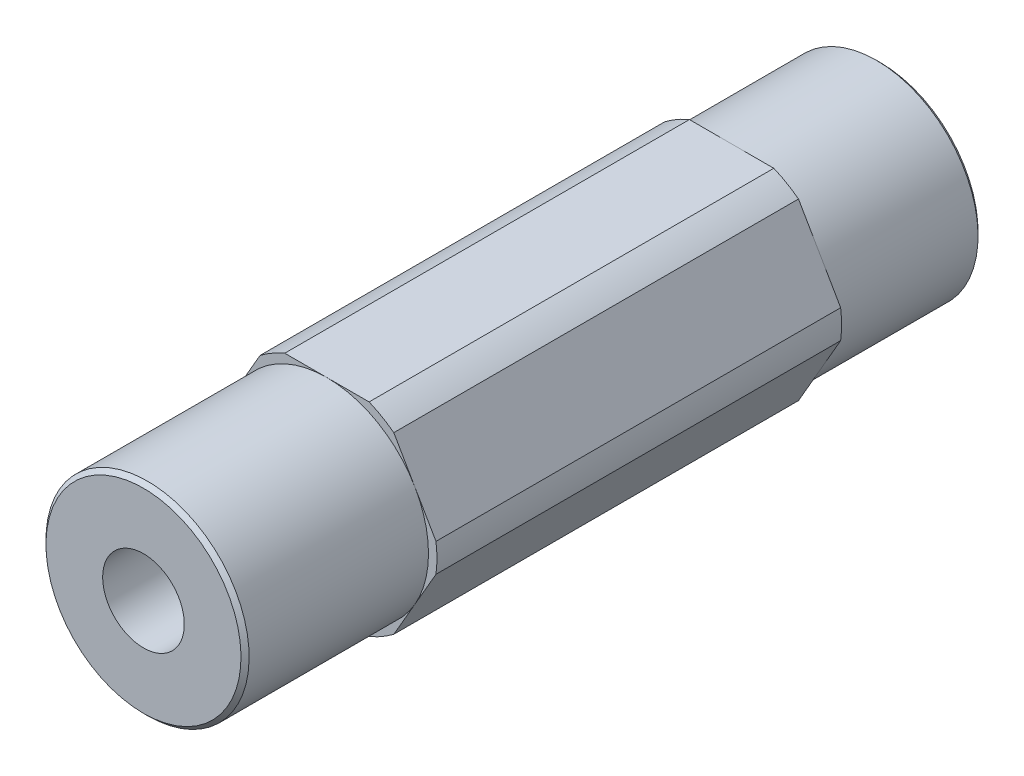
ISO-10303-21;
HEADER;
FILE_DESCRIPTION(('STEP AP214'),'2;1');
FILE_NAME('part.step','',(''),(''),'','','');
FILE_SCHEMA(('AUTOMOTIVE_DESIGN { 1 0 10303 214 1 1 1 1 }'));
ENDSEC;
DATA;
#1=APPLICATION_CONTEXT('core data for automotive mechanical design processes');
#2=APPLICATION_PROTOCOL_DEFINITION('international standard','automotive_design',2000,#1);
#3=PRODUCT_CONTEXT('',#1,'mechanical');
#4=PRODUCT('Part','Part','',(#3));
#5=PRODUCT_RELATED_PRODUCT_CATEGORY('part','',(#4));
#6=PRODUCT_DEFINITION_FORMATION('','',#4);
#7=PRODUCT_DEFINITION_CONTEXT('part definition',#1,'design');
#8=PRODUCT_DEFINITION('design','',#6,#7);
#9=PRODUCT_DEFINITION_SHAPE('','',#8);
#10=(LENGTH_UNIT() NAMED_UNIT(*) SI_UNIT(.MILLI.,.METRE.));
#11=(NAMED_UNIT(*) PLANE_ANGLE_UNIT() SI_UNIT($,.RADIAN.));
#12=(NAMED_UNIT(*) SI_UNIT($,.STERADIAN.) SOLID_ANGLE_UNIT());
#13=UNCERTAINTY_MEASURE_WITH_UNIT(LENGTH_MEASURE(1.E-05),#10,'distance_accuracy_value','');
#14=(GEOMETRIC_REPRESENTATION_CONTEXT(3) GLOBAL_UNCERTAINTY_ASSIGNED_CONTEXT((#13)) GLOBAL_UNIT_ASSIGNED_CONTEXT((#10,
#11,#12)) REPRESENTATION_CONTEXT('',''));
#15=CARTESIAN_POINT('',(0.,0.,0.));
#16=DIRECTION('',(0.,0.,1.));
#17=DIRECTION('',(1.,0.,0.));
#18=AXIS2_PLACEMENT_3D('',#15,#16,#17);
#19=CARTESIAN_POINT('',(0.,6.87577999999999,34.6075));
#20=DIRECTION('',(0.,0.,1.));
#21=DIRECTION('',(0.,-1.,0.));
#22=AXIS2_PLACEMENT_3D('',#19,#20,#21);
#23=PLANE('',#22);
#24=CARTESIAN_POINT('',(0.,0.,34.6075));
#25=DIRECTION('',(0.,0.,-1.));
#26=DIRECTION('',(0.,1.,0.));
#27=AXIS2_PLACEMENT_3D('',#24,#25,#26);
#28=CIRCLE('',#27,6.87577999999999);
#29=CARTESIAN_POINT('',(-2.63701547367471,-6.35000000000001,34.6075));
#30=VERTEX_POINT('',#29);
#31=CARTESIAN_POINT('',(-4.18075357719383,-5.45872239037497,34.6075));
#32=VERTEX_POINT('',#31);
#33=EDGE_CURVE('E376',#30,#32,#28,.T.);
#34=ORIENTED_EDGE('',*,*,#33,.F.);
#35=DIRECTION('',(1.,0.,0.));
#36=VECTOR('',#35,1.);
#37=CARTESIAN_POINT('',(0.,-6.35,34.6075));
#38=LINE('',#37,#36);
#39=CARTESIAN_POINT('',(0.,-6.35,34.6075));
#40=VERTEX_POINT('',#39);
#41=EDGE_CURVE('E354',#30,#40,#38,.T.);
#42=ORIENTED_EDGE('',*,*,#41,.T.);
#43=CARTESIAN_POINT('',(0.,0.,34.6075));
#44=DIRECTION('',(0.,0.,-1.));
#45=DIRECTION('',(0.,1.,0.));
#46=AXIS2_PLACEMENT_3D('',#43,#44,#45);
#47=CIRCLE('',#46,6.35);
#48=CARTESIAN_POINT('',(-5.49926131403118,-3.17500000000001,34.6075));
#49=VERTEX_POINT('',#48);
#50=EDGE_CURVE('E286',#40,#49,#47,.T.);
#51=ORIENTED_EDGE('',*,*,#50,.T.);
#52=DIRECTION('',(0.5,-0.866025403784439,0.));
#53=VECTOR('',#52,1.);
#54=CARTESIAN_POINT('',(-8.47656138944766,1.98183499999999,34.6075));
#55=LINE('',#54,#53);
#56=EDGE_CURVE('E386',#49,#32,#55,.T.);
#57=ORIENTED_EDGE('',*,*,#56,.T.);
#58=EDGE_LOOP('',(#34,#42,#51,#57));
#59=FACE_BOUND('',#58,.T.);
#60=ADVANCED_FACE('F49',(#59),#23,.T.);
#61=CARTESIAN_POINT('',(5.49926131403119,-3.17500000000001,34.6075));
#62=VERTEX_POINT('',#61);
#63=EDGE_CURVE('E287',#62,#40,#47,.T.);
#64=ORIENTED_EDGE('',*,*,#63,.T.);
#65=CARTESIAN_POINT('',(2.63701547367472,-6.35000000000001,34.6075));
#66=VERTEX_POINT('',#65);
#67=EDGE_CURVE('E357',#40,#66,#38,.T.);
#68=ORIENTED_EDGE('',*,*,#67,.T.);
#69=CARTESIAN_POINT('',(4.18075357719383,-5.45872239037496,34.6075));
#70=VERTEX_POINT('',#69);
#71=EDGE_CURVE('E371',#70,#66,#28,.T.);
#72=ORIENTED_EDGE('',*,*,#71,.F.);
#73=DIRECTION('',(0.5,0.866025403784439,0.));
#74=VECTOR('',#73,1.);
#75=CARTESIAN_POINT('',(8.47656138944767,1.98183499999999,34.6075));
#76=LINE('',#75,#74);
#77=EDGE_CURVE('E341',#70,#62,#76,.T.);
#78=ORIENTED_EDGE('',*,*,#77,.T.);
#79=EDGE_LOOP('',(#64,#68,#72,#78));
#80=FACE_BOUND('',#79,.T.);
#81=ADVANCED_FACE('F250',(#80),#23,.T.);
#82=CARTESIAN_POINT('',(5.49926131403119,3.17499999999999,34.6075));
#83=VERTEX_POINT('',#82);
#84=EDGE_CURVE('E229',#83,#62,#47,.T.);
#85=ORIENTED_EDGE('',*,*,#84,.T.);
#86=CARTESIAN_POINT('',(6.81776905086854,-0.891277609625052,34.6075));
#87=VERTEX_POINT('',#86);
#88=EDGE_CURVE('E344',#62,#87,#76,.T.);
#89=ORIENTED_EDGE('',*,*,#88,.T.);
#90=CARTESIAN_POINT('',(6.81776905086855,0.891277609625033,34.6075));
#91=VERTEX_POINT('',#90);
#92=EDGE_CURVE('E224',#91,#87,#28,.T.);
#93=ORIENTED_EDGE('',*,*,#92,.F.);
#94=DIRECTION('',(-0.5,0.866025403784439,0.));
#95=VECTOR('',#94,1.);
#96=CARTESIAN_POINT('',(2.52196123861471,8.33183499999999,34.6075));
#97=LINE('',#96,#95);
#98=EDGE_CURVE('E328',#91,#83,#97,.T.);
#99=ORIENTED_EDGE('',*,*,#98,.T.);
#100=EDGE_LOOP('',(#85,#89,#93,#99));
#101=FACE_BOUND('',#100,.T.);
#102=ADVANCED_FACE('F257',(#101),#23,.T.);
#103=CARTESIAN_POINT('',(0.,6.35,34.6075));
#104=VERTEX_POINT('',#103);
#105=EDGE_CURVE('E225',#104,#83,#47,.T.);
#106=ORIENTED_EDGE('',*,*,#105,.T.);
#107=CARTESIAN_POINT('',(4.18075357719383,5.45872239037495,34.6075));
#108=VERTEX_POINT('',#107);
#109=EDGE_CURVE('E303',#83,#108,#97,.T.);
#110=ORIENTED_EDGE('',*,*,#109,.T.);
#111=CARTESIAN_POINT('',(2.63701547367471,6.35,34.6075));
#112=VERTEX_POINT('',#111);
#113=EDGE_CURVE('E220',#112,#108,#28,.T.);
#114=ORIENTED_EDGE('',*,*,#113,.F.);
#115=DIRECTION('',(-1.,0.,0.));
#116=VECTOR('',#115,1.);
#117=CARTESIAN_POINT('',(0.,6.35,34.6075));
#118=LINE('',#117,#116);
#119=EDGE_CURVE('E304',#112,#104,#118,.T.);
#120=ORIENTED_EDGE('',*,*,#119,.T.);
#121=EDGE_LOOP('',(#106,#110,#114,#120));
#122=FACE_BOUND('',#121,.T.);
#123=ADVANCED_FACE('F273',(#122),#23,.T.);
#124=CARTESIAN_POINT('',(-5.49926131403119,3.17499999999999,34.6075));
#125=VERTEX_POINT('',#124);
#126=EDGE_CURVE('E223',#125,#104,#47,.T.);
#127=ORIENTED_EDGE('',*,*,#126,.T.);
#128=CARTESIAN_POINT('',(-2.63701547367471,6.35,34.6075));
#129=VERTEX_POINT('',#128);
#130=EDGE_CURVE('E293',#104,#129,#118,.T.);
#131=ORIENTED_EDGE('',*,*,#130,.T.);
#132=CARTESIAN_POINT('',(-4.18075357719383,5.45872239037495,34.6075));
#133=VERTEX_POINT('',#132);
#134=EDGE_CURVE('E218',#133,#129,#28,.T.);
#135=ORIENTED_EDGE('',*,*,#134,.F.);
#136=DIRECTION('',(-0.5,-0.866025403784439,0.));
#137=VECTOR('',#136,1.);
#138=CARTESIAN_POINT('',(-2.52196123861471,8.33183499999999,34.6075));
#139=LINE('',#138,#137);
#140=EDGE_CURVE('E295',#133,#125,#139,.T.);
#141=ORIENTED_EDGE('',*,*,#140,.T.);
#142=EDGE_LOOP('',(#127,#131,#135,#141));
#143=FACE_BOUND('',#142,.T.);
#144=ADVANCED_FACE('F264',(#143),#23,.T.);
#145=EDGE_CURVE('E279',#49,#125,#47,.T.);
#146=ORIENTED_EDGE('',*,*,#145,.T.);
#147=CARTESIAN_POINT('',(-6.81776905086855,0.89127760962503,34.6075));
#148=VERTEX_POINT('',#147);
#149=EDGE_CURVE('E281',#125,#148,#139,.T.);
#150=ORIENTED_EDGE('',*,*,#149,.T.);
#151=CARTESIAN_POINT('',(-6.81776905086855,-0.891277609625049,34.6075));
#152=VERTEX_POINT('',#151);
#153=EDGE_CURVE('E379',#152,#148,#28,.T.);
#154=ORIENTED_EDGE('',*,*,#153,.F.);
#155=EDGE_CURVE('E192',#152,#49,#55,.T.);
#156=ORIENTED_EDGE('',*,*,#155,.T.);
#157=EDGE_LOOP('',(#146,#150,#154,#156));
#158=FACE_BOUND('',#157,.T.);
#159=ADVANCED_FACE('F253',(#158),#23,.T.);
#160=CARTESIAN_POINT('',(0.,0.,-29.5405141562854));
#161=DIRECTION('',(0.,0.,-1.));
#162=DIRECTION('',(0.,1.,0.));
#163=AXIS2_PLACEMENT_3D('',#160,#161,#162);
#164=CYLINDRICAL_SURFACE('',#163,6.87577999999999);
#165=CARTESIAN_POINT('',(0.,0.,9.3091));
#166=DIRECTION('',(0.,0.,-1.));
#167=DIRECTION('',(0.,1.,0.));
#168=AXIS2_PLACEMENT_3D('',#165,#166,#167);
#169=CIRCLE('',#168,6.87577999999999);
#170=CARTESIAN_POINT('',(-2.63701547367472,-6.35,9.3091));
#171=VERTEX_POINT('',#170);
#172=CARTESIAN_POINT('',(-4.18075357719383,-5.45872239037497,9.3091));
#173=VERTEX_POINT('',#172);
#174=EDGE_CURVE('E190',#171,#173,#169,.T.);
#175=ORIENTED_EDGE('',*,*,#174,.F.);
#176=DIRECTION('',(0.,0.,-1.));
#177=VECTOR('',#176,1.);
#178=CARTESIAN_POINT('',(-2.63701547367471,-6.35,-29.5405141562854));
#179=LINE('',#178,#177);
#180=EDGE_CURVE('E350',#171,#30,#179,.F.);
#181=ORIENTED_EDGE('',*,*,#180,.T.);
#182=ORIENTED_EDGE('',*,*,#33,.T.);
#183=DIRECTION('',(0.,0.,-1.));
#184=VECTOR('',#183,1.);
#185=CARTESIAN_POINT('',(-4.18075357719383,-5.45872239037496,-29.5405141562854));
#186=LINE('',#185,#184);
#187=EDGE_CURVE('E191',#32,#173,#186,.T.);
#188=ORIENTED_EDGE('',*,*,#187,.T.);
#189=EDGE_LOOP('',(#175,#181,#182,#188));
#190=FACE_BOUND('',#189,.T.);
#191=ADVANCED_FACE('F263',(#190),#164,.T.);
#192=ORIENTED_EDGE('',*,*,#71,.T.);
#193=DIRECTION('',(0.,0.,-1.));
#194=VECTOR('',#193,1.);
#195=CARTESIAN_POINT('',(2.63701547367472,-6.35,-29.5405141562854));
#196=LINE('',#195,#194);
#197=CARTESIAN_POINT('',(2.63701547367472,-6.35,9.3091));
#198=VERTEX_POINT('',#197);
#199=EDGE_CURVE('E358',#66,#198,#196,.T.);
#200=ORIENTED_EDGE('',*,*,#199,.T.);
#201=CARTESIAN_POINT('',(4.18075357719383,-5.45872239037496,9.3091));
#202=VERTEX_POINT('',#201);
#203=EDGE_CURVE('E642',#202,#198,#169,.T.);
#204=ORIENTED_EDGE('',*,*,#203,.F.);
#205=DIRECTION('',(0.,0.,-1.));
#206=VECTOR('',#205,1.);
#207=CARTESIAN_POINT('',(4.18075357719383,-5.45872239037496,-29.5405141562854));
#208=LINE('',#207,#206);
#209=EDGE_CURVE('E337',#202,#70,#208,.F.);
#210=ORIENTED_EDGE('',*,*,#209,.T.);
#211=EDGE_LOOP('',(#192,#200,#204,#210));
#212=FACE_BOUND('',#211,.T.);
#213=ADVANCED_FACE('F270',(#212),#164,.T.);
#214=ORIENTED_EDGE('',*,*,#92,.T.);
#215=DIRECTION('',(0.,0.,-1.));
#216=VECTOR('',#215,1.);
#217=CARTESIAN_POINT('',(6.81776905086854,-0.891277609625044,-29.5405141562854));
#218=LINE('',#217,#216);
#219=CARTESIAN_POINT('',(6.81776905086855,-0.891277609625045,9.3091));
#220=VERTEX_POINT('',#219);
#221=EDGE_CURVE('E345',#87,#220,#218,.T.);
#222=ORIENTED_EDGE('',*,*,#221,.T.);
#223=CARTESIAN_POINT('',(6.81776905086854,0.891277609625047,9.3091));
#224=VERTEX_POINT('',#223);
#225=EDGE_CURVE('E219',#224,#220,#169,.T.);
#226=ORIENTED_EDGE('',*,*,#225,.F.);
#227=DIRECTION('',(0.,0.,-1.));
#228=VECTOR('',#227,1.);
#229=CARTESIAN_POINT('',(6.81776905086855,0.891277609625041,-29.5405141562854));
#230=LINE('',#229,#228);
#231=EDGE_CURVE('E318',#224,#91,#230,.F.);
#232=ORIENTED_EDGE('',*,*,#231,.T.);
#233=EDGE_LOOP('',(#214,#222,#226,#232));
#234=FACE_BOUND('',#233,.T.);
#235=ADVANCED_FACE('F488',(#234),#164,.T.);
#236=ORIENTED_EDGE('',*,*,#113,.T.);
#237=DIRECTION('',(0.,0.,-1.));
#238=VECTOR('',#237,1.);
#239=CARTESIAN_POINT('',(4.18075357719383,5.45872239037496,-29.5405141562854));
#240=LINE('',#239,#238);
#241=CARTESIAN_POINT('',(4.18075357719384,5.45872239037495,9.3091));
#242=VERTEX_POINT('',#241);
#243=EDGE_CURVE('E331',#108,#242,#240,.T.);
#244=ORIENTED_EDGE('',*,*,#243,.T.);
#245=CARTESIAN_POINT('',(2.6370154736747,6.35,9.3091));
#246=VERTEX_POINT('',#245);
#247=EDGE_CURVE('E215',#246,#242,#169,.T.);
#248=ORIENTED_EDGE('',*,*,#247,.F.);
#249=DIRECTION('',(0.,0.,-1.));
#250=VECTOR('',#249,1.);
#251=CARTESIAN_POINT('',(2.63701547367471,6.35,-29.5405141562854));
#252=LINE('',#251,#250);
#253=EDGE_CURVE('E308',#246,#112,#252,.F.);
#254=ORIENTED_EDGE('',*,*,#253,.T.);
#255=EDGE_LOOP('',(#236,#244,#248,#254));
#256=FACE_BOUND('',#255,.T.);
#257=ADVANCED_FACE('F398',(#256),#164,.T.);
#258=ORIENTED_EDGE('',*,*,#134,.T.);
#259=DIRECTION('',(0.,0.,-1.));
#260=VECTOR('',#259,1.);
#261=CARTESIAN_POINT('',(-2.63701547367471,6.35,-29.5405141562854));
#262=LINE('',#261,#260);
#263=CARTESIAN_POINT('',(-2.6370154736747,6.35,9.3091));
#264=VERTEX_POINT('',#263);
#265=EDGE_CURVE('E311',#129,#264,#262,.T.);
#266=ORIENTED_EDGE('',*,*,#265,.T.);
#267=CARTESIAN_POINT('',(-4.18075357719383,5.45872239037495,9.3091));
#268=VERTEX_POINT('',#267);
#269=EDGE_CURVE('E212',#268,#264,#169,.T.);
#270=ORIENTED_EDGE('',*,*,#269,.F.);
#271=DIRECTION('',(0.,0.,-1.));
#272=VECTOR('',#271,1.);
#273=CARTESIAN_POINT('',(-4.18075357719383,5.45872239037496,-29.5405141562854));
#274=LINE('',#273,#272);
#275=EDGE_CURVE('E64',#268,#133,#274,.F.);
#276=ORIENTED_EDGE('',*,*,#275,.T.);
#277=EDGE_LOOP('',(#258,#266,#270,#276));
#278=FACE_BOUND('',#277,.T.);
#279=ADVANCED_FACE('F382',(#278),#164,.T.);
#280=ORIENTED_EDGE('',*,*,#153,.T.);
#281=DIRECTION('',(0.,0.,-1.));
#282=VECTOR('',#281,1.);
#283=CARTESIAN_POINT('',(-6.81776905086855,0.891277609625038,-29.5405141562854));
#284=LINE('',#283,#282);
#285=CARTESIAN_POINT('',(-6.81776905086854,0.891277609625042,9.3091));
#286=VERTEX_POINT('',#285);
#287=EDGE_CURVE('E390',#148,#286,#284,.T.);
#288=ORIENTED_EDGE('',*,*,#287,.T.);
#289=CARTESIAN_POINT('',(-6.81776905086855,-0.891277609625042,9.3091));
#290=VERTEX_POINT('',#289);
#291=EDGE_CURVE('E644',#290,#286,#169,.T.);
#292=ORIENTED_EDGE('',*,*,#291,.F.);
#293=DIRECTION('',(0.,0.,-1.));
#294=VECTOR('',#293,1.);
#295=CARTESIAN_POINT('',(-6.81776905086855,-0.891277609625041,-29.5405141562854));
#296=LINE('',#295,#294);
#297=EDGE_CURVE('E72',#290,#152,#296,.F.);
#298=ORIENTED_EDGE('',*,*,#297,.T.);
#299=EDGE_LOOP('',(#280,#288,#292,#298));
#300=FACE_BOUND('',#299,.T.);
#301=ADVANCED_FACE('F272',(#300),#164,.T.);
#302=CARTESIAN_POINT('',(0.,6.87577999999999,9.3091));
#303=DIRECTION('',(0.,0.,-1.));
#304=DIRECTION('',(0.,1.,0.));
#305=AXIS2_PLACEMENT_3D('',#302,#303,#304);
#306=PLANE('',#305);
#307=ORIENTED_EDGE('',*,*,#203,.T.);
#308=DIRECTION('',(-1.,0.,0.));
#309=VECTOR('',#308,1.);
#310=CARTESIAN_POINT('',(0.,-6.35,9.3091));
#311=LINE('',#310,#309);
#312=CARTESIAN_POINT('',(0.,-6.35,9.3091));
#313=VERTEX_POINT('',#312);
#314=EDGE_CURVE('E351',#198,#313,#311,.T.);
#315=ORIENTED_EDGE('',*,*,#314,.T.);
#316=CARTESIAN_POINT('',(0.,0.,9.3091));
#317=DIRECTION('',(0.,0.,-1.));
#318=DIRECTION('',(0.,1.,0.));
#319=AXIS2_PLACEMENT_3D('',#316,#317,#318);
#320=CIRCLE('',#319,6.35);
#321=CARTESIAN_POINT('',(5.49926131403119,-3.175,9.3091));
#322=VERTEX_POINT('',#321);
#323=EDGE_CURVE('E206',#322,#313,#320,.T.);
#324=ORIENTED_EDGE('',*,*,#323,.F.);
#325=DIRECTION('',(-0.5,-0.866025403784439,0.));
#326=VECTOR('',#325,1.);
#327=CARTESIAN_POINT('',(8.47656138944767,1.98183499999999,9.3091));
#328=LINE('',#327,#326);
#329=EDGE_CURVE('E334',#322,#202,#328,.T.);
#330=ORIENTED_EDGE('',*,*,#329,.T.);
#331=EDGE_LOOP('',(#307,#315,#324,#330));
#332=FACE_BOUND('',#331,.T.);
#333=ADVANCED_FACE('F433',(#332),#306,.T.);
#334=CARTESIAN_POINT('',(-5.49926131403119,-3.175,9.3091));
#335=VERTEX_POINT('',#334);
#336=EDGE_CURVE('E187',#313,#335,#320,.T.);
#337=ORIENTED_EDGE('',*,*,#336,.F.);
#338=EDGE_CURVE('E348',#313,#171,#311,.T.);
#339=ORIENTED_EDGE('',*,*,#338,.T.);
#340=ORIENTED_EDGE('',*,*,#174,.T.);
#341=DIRECTION('',(-0.5,0.866025403784439,0.));
#342=VECTOR('',#341,1.);
#343=CARTESIAN_POINT('',(-8.47656138944766,1.98183499999999,9.3091));
#344=LINE('',#343,#342);
#345=EDGE_CURVE('E174',#173,#335,#344,.T.);
#346=ORIENTED_EDGE('',*,*,#345,.T.);
#347=EDGE_LOOP('',(#337,#339,#340,#346));
#348=FACE_BOUND('',#347,.T.);
#349=ADVANCED_FACE('F184',(#348),#306,.T.);
#350=ORIENTED_EDGE('',*,*,#225,.T.);
#351=EDGE_CURVE('E338',#220,#322,#328,.T.);
#352=ORIENTED_EDGE('',*,*,#351,.T.);
#353=CARTESIAN_POINT('',(5.49926131403119,3.17499999999999,9.3091));
#354=VERTEX_POINT('',#353);
#355=EDGE_CURVE('E207',#354,#322,#320,.T.);
#356=ORIENTED_EDGE('',*,*,#355,.F.);
#357=DIRECTION('',(0.5,-0.866025403784439,0.));
#358=VECTOR('',#357,1.);
#359=CARTESIAN_POINT('',(2.52196123861471,8.33183499999999,9.3091));
#360=LINE('',#359,#358);
#361=EDGE_CURVE('E316',#354,#224,#360,.T.);
#362=ORIENTED_EDGE('',*,*,#361,.T.);
#363=EDGE_LOOP('',(#350,#352,#356,#362));
#364=FACE_BOUND('',#363,.T.);
#365=ADVANCED_FACE('F405',(#364),#306,.T.);
#366=ORIENTED_EDGE('',*,*,#247,.T.);
#367=EDGE_CURVE('E320',#242,#354,#360,.T.);
#368=ORIENTED_EDGE('',*,*,#367,.T.);
#369=CARTESIAN_POINT('',(0.,6.35,9.3091));
#370=VERTEX_POINT('',#369);
#371=EDGE_CURVE('E208',#370,#354,#320,.T.);
#372=ORIENTED_EDGE('',*,*,#371,.F.);
#373=DIRECTION('',(1.,0.,0.));
#374=VECTOR('',#373,1.);
#375=CARTESIAN_POINT('',(0.,6.35,9.3091));
#376=LINE('',#375,#374);
#377=EDGE_CURVE('E313',#370,#246,#376,.T.);
#378=ORIENTED_EDGE('',*,*,#377,.T.);
#379=EDGE_LOOP('',(#366,#368,#372,#378));
#380=FACE_BOUND('',#379,.T.);
#381=ADVANCED_FACE('F395',(#380),#306,.T.);
#382=ORIENTED_EDGE('',*,*,#269,.T.);
#383=EDGE_CURVE('E307',#264,#370,#376,.T.);
#384=ORIENTED_EDGE('',*,*,#383,.T.);
#385=CARTESIAN_POINT('',(-5.49926131403119,3.17499999999999,9.3091));
#386=VERTEX_POINT('',#385);
#387=EDGE_CURVE('E201',#386,#370,#320,.T.);
#388=ORIENTED_EDGE('',*,*,#387,.F.);
#389=DIRECTION('',(0.5,0.866025403784439,0.));
#390=VECTOR('',#389,1.);
#391=CARTESIAN_POINT('',(-2.52196123861471,8.33183499999999,9.3091));
#392=LINE('',#391,#390);
#393=EDGE_CURVE('E383',#386,#268,#392,.T.);
#394=ORIENTED_EDGE('',*,*,#393,.T.);
#395=EDGE_LOOP('',(#382,#384,#388,#394));
#396=FACE_BOUND('',#395,.T.);
#397=ADVANCED_FACE('F408',(#396),#306,.T.);
#398=ORIENTED_EDGE('',*,*,#291,.T.);
#399=EDGE_CURVE('E197',#286,#386,#392,.T.);
#400=ORIENTED_EDGE('',*,*,#399,.T.);
#401=EDGE_CURVE('E195',#335,#386,#320,.T.);
#402=ORIENTED_EDGE('',*,*,#401,.F.);
#403=EDGE_CURVE('E171',#335,#290,#344,.T.);
#404=ORIENTED_EDGE('',*,*,#403,.T.);
#405=EDGE_LOOP('',(#398,#400,#402,#404));
#406=FACE_BOUND('',#405,.T.);
#407=ADVANCED_FACE('F196',(#406),#306,.T.);
#408=CARTESIAN_POINT('',(0.,0.,0.));
#409=DIRECTION('',(0.,0.,-1.));
#410=DIRECTION('',(0.,1.,0.));
#411=AXIS2_PLACEMENT_3D('',#408,#409,#410);
#412=PLANE('',#411);
#413=CARTESIAN_POINT('',(0.,0.,0.));
#414=DIRECTION('',(0.,0.,-1.));
#415=DIRECTION('',(0.,1.,0.));
#416=AXIS2_PLACEMENT_3D('',#413,#414,#415);
#417=CIRCLE('',#416,6.096);
#418=CARTESIAN_POINT('',(0.,6.096,0.));
#419=VERTEX_POINT('',#418);
#420=EDGE_CURVE('E228',#419,#419,#417,.T.);
#421=ORIENTED_EDGE('',*,*,#420,.T.);
#422=EDGE_LOOP('',(#421));
#423=FACE_BOUND('',#422,.T.);
#424=CARTESIAN_POINT('',(0.,0.,0.));
#425=DIRECTION('',(0.,0.,-1.));
#426=DIRECTION('',(-1.,0.,0.));
#427=AXIS2_PLACEMENT_3D('',#424,#425,#426);
#428=CIRCLE('',#427,2.5527);
#429=CARTESIAN_POINT('',(-2.5527,0.,0.));
#430=VERTEX_POINT('',#429);
#431=EDGE_CURVE('E213',#430,#430,#428,.T.);
#432=ORIENTED_EDGE('',*,*,#431,.F.);
#433=EDGE_LOOP('',(#432));
#434=FACE_BOUND('',#433,.T.);
#435=ADVANCED_FACE('F441',(#423,#434),#412,.T.);
#436=CARTESIAN_POINT('',(0.,6.34999999999999,46.0756));
#437=DIRECTION('',(0.,0.,1.));
#438=DIRECTION('',(0.,-1.,0.));
#439=AXIS2_PLACEMENT_3D('',#436,#437,#438);
#440=PLANE('',#439);
#441=CARTESIAN_POINT('',(0.,0.,46.0756));
#442=DIRECTION('',(0.,0.,1.));
#443=DIRECTION('',(0.,-1.,0.));
#444=AXIS2_PLACEMENT_3D('',#441,#442,#443);
#445=CIRCLE('',#444,6.09599999999999);
#446=CARTESIAN_POINT('',(0.,-6.096,46.0756));
#447=VERTEX_POINT('',#446);
#448=EDGE_CURVE('E14',#447,#447,#445,.T.);
#449=ORIENTED_EDGE('',*,*,#448,.T.);
#450=EDGE_LOOP('',(#449));
#451=FACE_BOUND('',#450,.T.);
#452=CARTESIAN_POINT('',(0.,0.,46.0756));
#453=DIRECTION('',(0.,0.,-1.));
#454=DIRECTION('',(-1.,0.,0.));
#455=AXIS2_PLACEMENT_3D('',#452,#453,#454);
#456=CIRCLE('',#455,2.5527);
#457=CARTESIAN_POINT('',(-2.5527,0.,46.0756));
#458=VERTEX_POINT('',#457);
#459=EDGE_CURVE('E360',#458,#458,#456,.T.);
#460=ORIENTED_EDGE('',*,*,#459,.T.);
#461=EDGE_LOOP('',(#460));
#462=FACE_BOUND('',#461,.T.);
#463=ADVANCED_FACE('F447',(#451,#462),#440,.T.);
#464=CARTESIAN_POINT('',(0.,0.,-29.5405141562854));
#465=DIRECTION('',(0.,0.,-1.));
#466=DIRECTION('',(0.,1.,0.));
#467=AXIS2_PLACEMENT_3D('',#464,#465,#466);
#468=CYLINDRICAL_SURFACE('',#467,6.35);
#469=CARTESIAN_POINT('',(0.,0.,45.8216));
#470=DIRECTION('',(0.,0.,1.));
#471=DIRECTION('',(0.,-1.,0.));
#472=AXIS2_PLACEMENT_3D('',#469,#470,#471);
#473=CIRCLE('',#472,6.35);
#474=CARTESIAN_POINT('',(0.,-6.35000000000001,45.8216));
#475=VERTEX_POINT('',#474);
#476=EDGE_CURVE('E57',#475,#475,#473,.F.);
#477=ORIENTED_EDGE('',*,*,#476,.T.);
#478=EDGE_LOOP('',(#477));
#479=FACE_BOUND('',#478,.T.);
#480=ORIENTED_EDGE('',*,*,#50,.F.);
#481=ORIENTED_EDGE('',*,*,#63,.F.);
#482=ORIENTED_EDGE('',*,*,#84,.F.);
#483=ORIENTED_EDGE('',*,*,#105,.F.);
#484=ORIENTED_EDGE('',*,*,#126,.F.);
#485=ORIENTED_EDGE('',*,*,#145,.F.);
#486=EDGE_LOOP('',(#480,#481,#482,#483,#484,#485));
#487=FACE_BOUND('',#486,.T.);
#488=ADVANCED_FACE('F237',(#479,#487),#468,.T.);
#489=CARTESIAN_POINT('',(0.,0.,-29.5405141562854));
#490=DIRECTION('',(0.,0.,-1.));
#491=DIRECTION('',(0.,1.,0.));
#492=AXIS2_PLACEMENT_3D('',#489,#490,#491);
#493=CYLINDRICAL_SURFACE('',#492,6.35);
#494=CARTESIAN_POINT('',(0.,0.,0.25399999999999));
#495=DIRECTION('',(0.,0.,-1.));
#496=DIRECTION('',(0.,1.,0.));
#497=AXIS2_PLACEMENT_3D('',#494,#495,#496);
#498=CIRCLE('',#497,6.35);
#499=CARTESIAN_POINT('',(0.,6.35,0.253999999999991));
#500=VERTEX_POINT('',#499);
#501=EDGE_CURVE('E232',#500,#500,#498,.F.);
#502=ORIENTED_EDGE('',*,*,#501,.T.);
#503=EDGE_LOOP('',(#502));
#504=FACE_BOUND('',#503,.T.);
#505=ORIENTED_EDGE('',*,*,#323,.T.);
#506=ORIENTED_EDGE('',*,*,#336,.T.);
#507=ORIENTED_EDGE('',*,*,#401,.T.);
#508=ORIENTED_EDGE('',*,*,#387,.T.);
#509=ORIENTED_EDGE('',*,*,#371,.T.);
#510=ORIENTED_EDGE('',*,*,#355,.T.);
#511=EDGE_LOOP('',(#505,#506,#507,#508,#509,#510));
#512=FACE_BOUND('',#511,.T.);
#513=ADVANCED_FACE('F203',(#504,#512),#493,.T.);
#514=CARTESIAN_POINT('',(0.,0.,46.0756));
#515=DIRECTION('',(0.,0.,-1.));
#516=DIRECTION('',(-1.,0.,0.));
#517=AXIS2_PLACEMENT_3D('',#514,#515,#516);
#518=CYLINDRICAL_SURFACE('',#517,2.5527);
#519=ORIENTED_EDGE('',*,*,#459,.F.);
#520=EDGE_LOOP('',(#519));
#521=FACE_BOUND('',#520,.T.);
#522=ORIENTED_EDGE('',*,*,#431,.T.);
#523=EDGE_LOOP('',(#522));
#524=FACE_BOUND('',#523,.T.);
#525=ADVANCED_FACE('F424',(#521,#524),#518,.F.);
#526=CARTESIAN_POINT('',(-3.66617420935412,-6.35,46.0756));
#527=DIRECTION('',(-0.866025403784439,-0.5,0.));
#528=DIRECTION('',(0.5,-0.866025403784439,0.));
#529=AXIS2_PLACEMENT_3D('',#526,#527,#528);
#530=PLANE('',#529);
#531=ORIENTED_EDGE('',*,*,#155,.F.);
#532=ORIENTED_EDGE('',*,*,#297,.F.);
#533=ORIENTED_EDGE('',*,*,#403,.F.);
#534=ORIENTED_EDGE('',*,*,#345,.F.);
#535=ORIENTED_EDGE('',*,*,#187,.F.);
#536=ORIENTED_EDGE('',*,*,#56,.F.);
#537=EDGE_LOOP('',(#531,#532,#533,#534,#535,#536));
#538=FACE_BOUND('',#537,.T.);
#539=ADVANCED_FACE('F173',(#538),#530,.T.);
#540=CARTESIAN_POINT('',(-7.33234841870825,0.,46.0756));
#541=DIRECTION('',(-0.866025403784439,0.5,0.));
#542=DIRECTION('',(-0.5,-0.866025403784439,0.));
#543=AXIS2_PLACEMENT_3D('',#540,#541,#542);
#544=PLANE('',#543);
#545=ORIENTED_EDGE('',*,*,#140,.F.);
#546=ORIENTED_EDGE('',*,*,#275,.F.);
#547=ORIENTED_EDGE('',*,*,#393,.F.);
#548=ORIENTED_EDGE('',*,*,#399,.F.);
#549=ORIENTED_EDGE('',*,*,#287,.F.);
#550=ORIENTED_EDGE('',*,*,#149,.F.);
#551=EDGE_LOOP('',(#545,#546,#547,#548,#549,#550));
#552=FACE_BOUND('',#551,.T.);
#553=ADVANCED_FACE('F411',(#552),#544,.T.);
#554=CARTESIAN_POINT('',(-3.66617420935412,6.35,46.0756));
#555=DIRECTION('',(0.,1.,0.));
#556=DIRECTION('',(-1.,0.,0.));
#557=AXIS2_PLACEMENT_3D('',#554,#555,#556);
#558=PLANE('',#557);
#559=ORIENTED_EDGE('',*,*,#119,.F.);
#560=ORIENTED_EDGE('',*,*,#253,.F.);
#561=ORIENTED_EDGE('',*,*,#377,.F.);
#562=ORIENTED_EDGE('',*,*,#383,.F.);
#563=ORIENTED_EDGE('',*,*,#265,.F.);
#564=ORIENTED_EDGE('',*,*,#130,.F.);
#565=EDGE_LOOP('',(#559,#560,#561,#562,#563,#564));
#566=FACE_BOUND('',#565,.T.);
#567=ADVANCED_FACE('F409',(#566),#558,.T.);
#568=CARTESIAN_POINT('',(3.66617420935412,6.35,46.0756));
#569=DIRECTION('',(0.866025403784439,0.5,0.));
#570=DIRECTION('',(-0.5,0.866025403784439,0.));
#571=AXIS2_PLACEMENT_3D('',#568,#569,#570);
#572=PLANE('',#571);
#573=ORIENTED_EDGE('',*,*,#98,.F.);
#574=ORIENTED_EDGE('',*,*,#231,.F.);
#575=ORIENTED_EDGE('',*,*,#361,.F.);
#576=ORIENTED_EDGE('',*,*,#367,.F.);
#577=ORIENTED_EDGE('',*,*,#243,.F.);
#578=ORIENTED_EDGE('',*,*,#109,.F.);
#579=EDGE_LOOP('',(#573,#574,#575,#576,#577,#578));
#580=FACE_BOUND('',#579,.T.);
#581=ADVANCED_FACE('F400',(#580),#572,.T.);
#582=CARTESIAN_POINT('',(7.33234841870825,0.,46.0756));
#583=DIRECTION('',(0.866025403784439,-0.5,0.));
#584=DIRECTION('',(0.5,0.866025403784439,0.));
#585=AXIS2_PLACEMENT_3D('',#582,#583,#584);
#586=PLANE('',#585);
#587=ORIENTED_EDGE('',*,*,#77,.F.);
#588=ORIENTED_EDGE('',*,*,#209,.F.);
#589=ORIENTED_EDGE('',*,*,#329,.F.);
#590=ORIENTED_EDGE('',*,*,#351,.F.);
#591=ORIENTED_EDGE('',*,*,#221,.F.);
#592=ORIENTED_EDGE('',*,*,#88,.F.);
#593=EDGE_LOOP('',(#587,#588,#589,#590,#591,#592));
#594=FACE_BOUND('',#593,.T.);
#595=ADVANCED_FACE('F417',(#594),#586,.T.);
#596=CARTESIAN_POINT('',(3.66617420935413,-6.35,46.0756));
#597=DIRECTION('',(0.,-1.,0.));
#598=DIRECTION('',(1.,0.,0.));
#599=AXIS2_PLACEMENT_3D('',#596,#597,#598);
#600=PLANE('',#599);
#601=ORIENTED_EDGE('',*,*,#41,.F.);
#602=ORIENTED_EDGE('',*,*,#180,.F.);
#603=ORIENTED_EDGE('',*,*,#338,.F.);
#604=ORIENTED_EDGE('',*,*,#314,.F.);
#605=ORIENTED_EDGE('',*,*,#199,.F.);
#606=ORIENTED_EDGE('',*,*,#67,.F.);
#607=EDGE_LOOP('',(#601,#602,#603,#604,#605,#606));
#608=FACE_BOUND('',#607,.T.);
#609=ADVANCED_FACE('F246',(#608),#600,.T.);
#610=CARTESIAN_POINT('',(0.,0.,0.));
#611=DIRECTION('',(0.,0.,1.));
#612=DIRECTION('',(0.,-1.,0.));
#613=AXIS2_PLACEMENT_3D('',#610,#611,#612);
#614=CONICAL_SURFACE('',#613,6.096,0.785398163397458);
#615=ORIENTED_EDGE('',*,*,#501,.F.);
#616=EDGE_LOOP('',(#615));
#617=FACE_BOUND('',#616,.T.);
#618=ORIENTED_EDGE('',*,*,#420,.F.);
#619=EDGE_LOOP('',(#618));
#620=FACE_BOUND('',#619,.T.);
#621=ADVANCED_FACE('F241',(#617,#620),#614,.T.);
#622=CARTESIAN_POINT('',(0.,0.,45.8216));
#623=DIRECTION('',(0.,0.,-1.));
#624=DIRECTION('',(0.,1.,0.));
#625=AXIS2_PLACEMENT_3D('',#622,#623,#624);
#626=CONICAL_SURFACE('',#625,6.35,0.785398163397458);
#627=ORIENTED_EDGE('',*,*,#448,.F.);
#628=EDGE_LOOP('',(#627));
#629=FACE_BOUND('',#628,.T.);
#630=ORIENTED_EDGE('',*,*,#476,.F.);
#631=EDGE_LOOP('',(#630));
#632=FACE_BOUND('',#631,.T.);
#633=ADVANCED_FACE('F51',(#629,#632),#626,.T.);
#634=CLOSED_SHELL('',(#60,#81,#102,#123,#144,#159,#191,#213,#235,#257,#279,#301,#333,#349,#365,
#381,#397,#407,#435,#463,#488,#513,#525,#539,#553,#567,#581,#595,#609,#621,#633));
#635=MANIFOLD_SOLID_BREP('B2',#634);
#636=ADVANCED_BREP_SHAPE_REPRESENTATION('',(#18,#635),#14);
#637=SHAPE_DEFINITION_REPRESENTATION(#9,#636);
ENDSEC;
END-ISO-10303-21;
